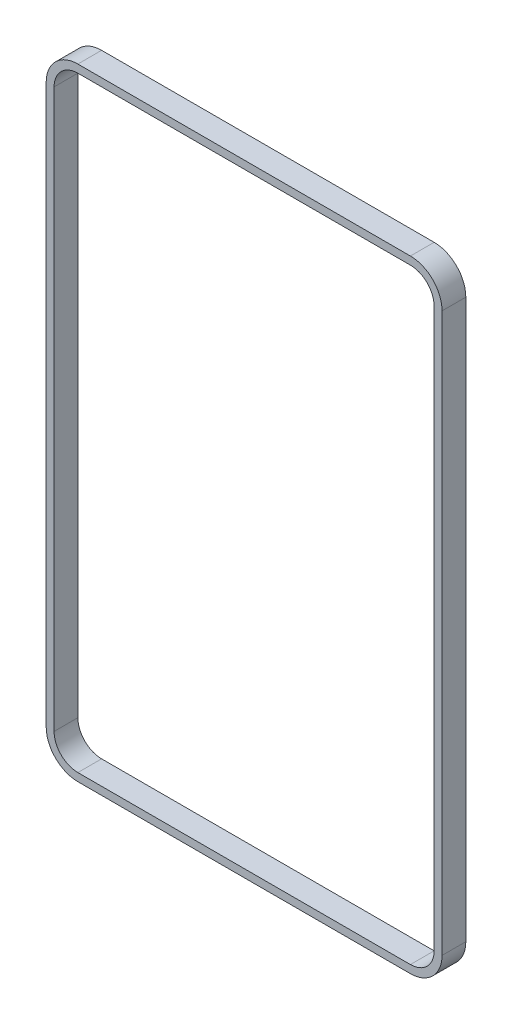
ISO-10303-21;
HEADER;
FILE_DESCRIPTION(('STEP AP214'),'2;1');
FILE_NAME('part.step','',(''),(''),'','','');
FILE_SCHEMA(('AUTOMOTIVE_DESIGN { 1 0 10303 214 1 1 1 1 }'));
ENDSEC;
DATA;
#1=APPLICATION_CONTEXT('core data for automotive mechanical design processes');
#2=APPLICATION_PROTOCOL_DEFINITION('international standard','automotive_design',2000,#1);
#3=PRODUCT_CONTEXT('',#1,'mechanical');
#4=PRODUCT('Part','Part','',(#3));
#5=PRODUCT_RELATED_PRODUCT_CATEGORY('part','',(#4));
#6=PRODUCT_DEFINITION_FORMATION('','',#4);
#7=PRODUCT_DEFINITION_CONTEXT('part definition',#1,'design');
#8=PRODUCT_DEFINITION('design','',#6,#7);
#9=PRODUCT_DEFINITION_SHAPE('','',#8);
#10=(LENGTH_UNIT() NAMED_UNIT(*) SI_UNIT(.MILLI.,.METRE.));
#11=(NAMED_UNIT(*) PLANE_ANGLE_UNIT() SI_UNIT($,.RADIAN.));
#12=(NAMED_UNIT(*) SI_UNIT($,.STERADIAN.) SOLID_ANGLE_UNIT());
#13=UNCERTAINTY_MEASURE_WITH_UNIT(LENGTH_MEASURE(1.E-05),#10,'distance_accuracy_value','');
#14=(GEOMETRIC_REPRESENTATION_CONTEXT(3) GLOBAL_UNCERTAINTY_ASSIGNED_CONTEXT((#13)) GLOBAL_UNIT_ASSIGNED_CONTEXT((#10,
#11,#12)) REPRESENTATION_CONTEXT('',''));
#15=CARTESIAN_POINT('',(0.,0.,0.));
#16=DIRECTION('',(0.,0.,1.));
#17=DIRECTION('',(1.,0.,0.));
#18=AXIS2_PLACEMENT_3D('',#15,#16,#17);
#19=CARTESIAN_POINT('',(13.49375,237.33125,0.));
#20=DIRECTION('',(0.,0.,1.));
#21=DIRECTION('',(1.,0.,0.));
#22=AXIS2_PLACEMENT_3D('',#19,#20,#21);
#23=CYLINDRICAL_SURFACE('',#22,9.52499999999999);
#24=CARTESIAN_POINT('',(13.49375,237.33125,9.525));
#25=DIRECTION('',(0.,0.,1.));
#26=DIRECTION('',(1.,0.,0.));
#27=AXIS2_PLACEMENT_3D('',#24,#25,#26);
#28=CIRCLE('',#27,9.52499999999999);
#29=CARTESIAN_POINT('',(13.49375,246.85625,9.525));
#30=VERTEX_POINT('',#29);
#31=CARTESIAN_POINT('',(3.96875,237.33125,9.525));
#32=VERTEX_POINT('',#31);
#33=EDGE_CURVE('E199',#30,#32,#28,.T.);
#34=ORIENTED_EDGE('',*,*,#33,.T.);
#35=DIRECTION('',(0.,0.,1.));
#36=VECTOR('',#35,1.);
#37=CARTESIAN_POINT('',(3.96875,237.33125,0.));
#38=LINE('',#37,#36);
#39=CARTESIAN_POINT('',(3.96875,237.33125,0.));
#40=VERTEX_POINT('',#39);
#41=EDGE_CURVE('E11',#40,#32,#38,.T.);
#42=ORIENTED_EDGE('',*,*,#41,.F.);
#43=CARTESIAN_POINT('',(13.49375,237.33125,0.));
#44=DIRECTION('',(0.,0.,1.));
#45=DIRECTION('',(1.,0.,0.));
#46=AXIS2_PLACEMENT_3D('',#43,#44,#45);
#47=CIRCLE('',#46,9.52499999999999);
#48=CARTESIAN_POINT('',(13.49375,246.85625,0.));
#49=VERTEX_POINT('',#48);
#50=EDGE_CURVE('E266',#49,#40,#47,.T.);
#51=ORIENTED_EDGE('',*,*,#50,.F.);
#52=DIRECTION('',(0.,0.,1.));
#53=VECTOR('',#52,1.);
#54=CARTESIAN_POINT('',(13.49375,246.85625,0.));
#55=LINE('',#54,#53);
#56=EDGE_CURVE('E227',#49,#30,#55,.T.);
#57=ORIENTED_EDGE('',*,*,#56,.T.);
#58=EDGE_LOOP('',(#34,#42,#51,#57));
#59=FACE_BOUND('',#58,.T.);
#60=ADVANCED_FACE('F36',(#59),#23,.F.);
#61=CARTESIAN_POINT('',(3.96875,0.,0.));
#62=DIRECTION('',(-1.,0.,0.));
#63=DIRECTION('',(0.,0.,1.));
#64=AXIS2_PLACEMENT_3D('',#61,#62,#63);
#65=PLANE('',#64);
#66=DIRECTION('',(0.,-1.,0.));
#67=VECTOR('',#66,1.);
#68=CARTESIAN_POINT('',(3.96875,0.,9.525));
#69=LINE('',#68,#67);
#70=CARTESIAN_POINT('',(3.96875,13.4937500000001,9.525));
#71=VERTEX_POINT('',#70);
#72=EDGE_CURVE('E104',#32,#71,#69,.T.);
#73=ORIENTED_EDGE('',*,*,#72,.T.);
#74=DIRECTION('',(0.,0.,1.));
#75=VECTOR('',#74,1.);
#76=CARTESIAN_POINT('',(3.96875,13.4937500000001,0.));
#77=LINE('',#76,#75);
#78=CARTESIAN_POINT('',(3.96875,13.4937500000001,0.));
#79=VERTEX_POINT('',#78);
#80=EDGE_CURVE('E46',#79,#71,#77,.T.);
#81=ORIENTED_EDGE('',*,*,#80,.F.);
#82=DIRECTION('',(0.,-1.,0.));
#83=VECTOR('',#82,1.);
#84=CARTESIAN_POINT('',(3.96875,0.,0.));
#85=LINE('',#84,#83);
#86=EDGE_CURVE('E54',#40,#79,#85,.T.);
#87=ORIENTED_EDGE('',*,*,#86,.F.);
#88=ORIENTED_EDGE('',*,*,#41,.T.);
#89=EDGE_LOOP('',(#73,#81,#87,#88));
#90=FACE_BOUND('',#89,.T.);
#91=ADVANCED_FACE('F304',(#90),#65,.F.);
#92=CARTESIAN_POINT('',(13.49375,13.49375,0.));
#93=DIRECTION('',(0.,0.,1.));
#94=DIRECTION('',(1.,0.,0.));
#95=AXIS2_PLACEMENT_3D('',#92,#93,#94);
#96=CYLINDRICAL_SURFACE('',#95,9.525);
#97=CARTESIAN_POINT('',(13.49375,13.49375,9.525));
#98=DIRECTION('',(0.,0.,1.));
#99=DIRECTION('',(1.,0.,0.));
#100=AXIS2_PLACEMENT_3D('',#97,#98,#99);
#101=CIRCLE('',#100,9.525);
#102=CARTESIAN_POINT('',(13.4937500000001,3.96875,9.525));
#103=VERTEX_POINT('',#102);
#104=EDGE_CURVE('E167',#71,#103,#101,.T.);
#105=ORIENTED_EDGE('',*,*,#104,.T.);
#106=DIRECTION('',(0.,0.,1.));
#107=VECTOR('',#106,1.);
#108=CARTESIAN_POINT('',(13.4937500000001,3.96875,0.));
#109=LINE('',#108,#107);
#110=CARTESIAN_POINT('',(13.4937500000001,3.96875,0.));
#111=VERTEX_POINT('',#110);
#112=EDGE_CURVE('E165',#111,#103,#109,.T.);
#113=ORIENTED_EDGE('',*,*,#112,.F.);
#114=CARTESIAN_POINT('',(13.49375,13.49375,0.));
#115=DIRECTION('',(0.,0.,1.));
#116=DIRECTION('',(1.,0.,0.));
#117=AXIS2_PLACEMENT_3D('',#114,#115,#116);
#118=CIRCLE('',#117,9.525);
#119=EDGE_CURVE('E156',#79,#111,#118,.T.);
#120=ORIENTED_EDGE('',*,*,#119,.F.);
#121=ORIENTED_EDGE('',*,*,#80,.T.);
#122=EDGE_LOOP('',(#105,#113,#120,#121));
#123=FACE_BOUND('',#122,.T.);
#124=ADVANCED_FACE('F166',(#123),#96,.F.);
#125=CARTESIAN_POINT('',(0.,3.96875,0.));
#126=DIRECTION('',(0.,-1.,0.));
#127=DIRECTION('',(1.,0.,0.));
#128=AXIS2_PLACEMENT_3D('',#125,#126,#127);
#129=PLANE('',#128);
#130=DIRECTION('',(1.,0.,0.));
#131=VECTOR('',#130,1.);
#132=CARTESIAN_POINT('',(0.,3.96875,9.525));
#133=LINE('',#132,#131);
#134=CARTESIAN_POINT('',(146.84375,3.96875,9.525));
#135=VERTEX_POINT('',#134);
#136=EDGE_CURVE('E214',#103,#135,#133,.T.);
#137=ORIENTED_EDGE('',*,*,#136,.T.);
#138=DIRECTION('',(0.,0.,1.));
#139=VECTOR('',#138,1.);
#140=CARTESIAN_POINT('',(146.84375,3.96875,0.));
#141=LINE('',#140,#139);
#142=CARTESIAN_POINT('',(146.84375,3.96875,0.));
#143=VERTEX_POINT('',#142);
#144=EDGE_CURVE('E170',#143,#135,#141,.T.);
#145=ORIENTED_EDGE('',*,*,#144,.F.);
#146=DIRECTION('',(1.,0.,0.));
#147=VECTOR('',#146,1.);
#148=CARTESIAN_POINT('',(0.,3.96875,0.));
#149=LINE('',#148,#147);
#150=EDGE_CURVE('E160',#111,#143,#149,.T.);
#151=ORIENTED_EDGE('',*,*,#150,.F.);
#152=ORIENTED_EDGE('',*,*,#112,.T.);
#153=EDGE_LOOP('',(#137,#145,#151,#152));
#154=FACE_BOUND('',#153,.T.);
#155=ADVANCED_FACE('F172',(#154),#129,.F.);
#156=CARTESIAN_POINT('',(146.84375,13.49375,0.));
#157=DIRECTION('',(0.,0.,1.));
#158=DIRECTION('',(1.,0.,0.));
#159=AXIS2_PLACEMENT_3D('',#156,#157,#158);
#160=CYLINDRICAL_SURFACE('',#159,9.52499999999999);
#161=CARTESIAN_POINT('',(146.84375,13.49375,9.525));
#162=DIRECTION('',(0.,0.,1.));
#163=DIRECTION('',(1.,0.,0.));
#164=AXIS2_PLACEMENT_3D('',#161,#162,#163);
#165=CIRCLE('',#164,9.52499999999999);
#166=CARTESIAN_POINT('',(156.36875,13.49375,9.525));
#167=VERTEX_POINT('',#166);
#168=EDGE_CURVE('E211',#135,#167,#165,.T.);
#169=ORIENTED_EDGE('',*,*,#168,.T.);
#170=DIRECTION('',(0.,0.,1.));
#171=VECTOR('',#170,1.);
#172=CARTESIAN_POINT('',(156.36875,13.49375,0.));
#173=LINE('',#172,#171);
#174=CARTESIAN_POINT('',(156.36875,13.49375,0.));
#175=VERTEX_POINT('',#174);
#176=EDGE_CURVE('E221',#175,#167,#173,.T.);
#177=ORIENTED_EDGE('',*,*,#176,.F.);
#178=CARTESIAN_POINT('',(146.84375,13.49375,0.));
#179=DIRECTION('',(0.,0.,1.));
#180=DIRECTION('',(1.,0.,0.));
#181=AXIS2_PLACEMENT_3D('',#178,#179,#180);
#182=CIRCLE('',#181,9.52499999999999);
#183=EDGE_CURVE('E175',#143,#175,#182,.T.);
#184=ORIENTED_EDGE('',*,*,#183,.F.);
#185=ORIENTED_EDGE('',*,*,#144,.T.);
#186=EDGE_LOOP('',(#169,#177,#184,#185));
#187=FACE_BOUND('',#186,.T.);
#188=ADVANCED_FACE('F318',(#187),#160,.F.);
#189=CARTESIAN_POINT('',(156.36875,0.,0.));
#190=DIRECTION('',(-1.,0.,0.));
#191=DIRECTION('',(0.,0.,1.));
#192=AXIS2_PLACEMENT_3D('',#189,#190,#191);
#193=PLANE('',#192);
#194=DIRECTION('',(0.,-1.,0.));
#195=VECTOR('',#194,1.);
#196=CARTESIAN_POINT('',(156.36875,0.,9.525));
#197=LINE('',#196,#195);
#198=CARTESIAN_POINT('',(156.36875,237.33125,9.525));
#199=VERTEX_POINT('',#198);
#200=EDGE_CURVE('E208',#199,#167,#197,.T.);
#201=ORIENTED_EDGE('',*,*,#200,.F.);
#202=DIRECTION('',(0.,0.,1.));
#203=VECTOR('',#202,1.);
#204=CARTESIAN_POINT('',(156.36875,237.33125,0.));
#205=LINE('',#204,#203);
#206=CARTESIAN_POINT('',(156.36875,237.33125,0.));
#207=VERTEX_POINT('',#206);
#208=EDGE_CURVE('E223',#207,#199,#205,.T.);
#209=ORIENTED_EDGE('',*,*,#208,.F.);
#210=DIRECTION('',(0.,-1.,0.));
#211=VECTOR('',#210,1.);
#212=CARTESIAN_POINT('',(156.36875,0.,0.));
#213=LINE('',#212,#211);
#214=EDGE_CURVE('E177',#207,#175,#213,.T.);
#215=ORIENTED_EDGE('',*,*,#214,.T.);
#216=ORIENTED_EDGE('',*,*,#176,.T.);
#217=EDGE_LOOP('',(#201,#209,#215,#216));
#218=FACE_BOUND('',#217,.T.);
#219=ADVANCED_FACE('F291',(#218),#193,.T.);
#220=CARTESIAN_POINT('',(146.84375,237.33125,0.));
#221=DIRECTION('',(0.,0.,1.));
#222=DIRECTION('',(1.,0.,0.));
#223=AXIS2_PLACEMENT_3D('',#220,#221,#222);
#224=CYLINDRICAL_SURFACE('',#223,9.52499999999998);
#225=CARTESIAN_POINT('',(146.84375,237.33125,9.525));
#226=DIRECTION('',(0.,0.,1.));
#227=DIRECTION('',(1.,0.,0.));
#228=AXIS2_PLACEMENT_3D('',#225,#226,#227);
#229=CIRCLE('',#228,9.52499999999998);
#230=CARTESIAN_POINT('',(146.84375,246.85625,9.525));
#231=VERTEX_POINT('',#230);
#232=EDGE_CURVE('E205',#231,#199,#229,.F.);
#233=ORIENTED_EDGE('',*,*,#232,.F.);
#234=DIRECTION('',(0.,0.,1.));
#235=VECTOR('',#234,1.);
#236=CARTESIAN_POINT('',(146.84375,246.85625,0.));
#237=LINE('',#236,#235);
#238=CARTESIAN_POINT('',(146.84375,246.85625,0.));
#239=VERTEX_POINT('',#238);
#240=EDGE_CURVE('E225',#239,#231,#237,.T.);
#241=ORIENTED_EDGE('',*,*,#240,.F.);
#242=CARTESIAN_POINT('',(146.84375,237.33125,0.));
#243=DIRECTION('',(0.,0.,1.));
#244=DIRECTION('',(1.,0.,0.));
#245=AXIS2_PLACEMENT_3D('',#242,#243,#244);
#246=CIRCLE('',#245,9.52499999999998);
#247=EDGE_CURVE('E285',#239,#207,#246,.F.);
#248=ORIENTED_EDGE('',*,*,#247,.T.);
#249=ORIENTED_EDGE('',*,*,#208,.T.);
#250=EDGE_LOOP('',(#233,#241,#248,#249));
#251=FACE_BOUND('',#250,.T.);
#252=ADVANCED_FACE('F297',(#251),#224,.F.);
#253=CARTESIAN_POINT('',(0.,0.79375,0.));
#254=DIRECTION('',(0.,1.,0.));
#255=DIRECTION('',(-1.,0.,0.));
#256=AXIS2_PLACEMENT_3D('',#253,#254,#255);
#257=PLANE('',#256);
#258=DIRECTION('',(-1.,0.,0.));
#259=VECTOR('',#258,1.);
#260=CARTESIAN_POINT('',(0.,0.79375,9.525));
#261=LINE('',#260,#259);
#262=CARTESIAN_POINT('',(146.84375,0.793749999999999,9.525));
#263=VERTEX_POINT('',#262);
#264=CARTESIAN_POINT('',(13.49375,0.793749999999998,9.525));
#265=VERTEX_POINT('',#264);
#266=EDGE_CURVE('E182',#263,#265,#261,.T.);
#267=ORIENTED_EDGE('',*,*,#266,.T.);
#268=DIRECTION('',(0.,0.,1.));
#269=VECTOR('',#268,1.);
#270=CARTESIAN_POINT('',(13.49375,0.793749999999998,0.));
#271=LINE('',#270,#269);
#272=CARTESIAN_POINT('',(13.49375,0.793749999999998,0.));
#273=VERTEX_POINT('',#272);
#274=EDGE_CURVE('E229',#273,#265,#271,.T.);
#275=ORIENTED_EDGE('',*,*,#274,.F.);
#276=DIRECTION('',(-1.,0.,0.));
#277=VECTOR('',#276,1.);
#278=CARTESIAN_POINT('',(0.,0.79375,0.));
#279=LINE('',#278,#277);
#280=CARTESIAN_POINT('',(146.84375,0.793749999999999,0.));
#281=VERTEX_POINT('',#280);
#282=EDGE_CURVE('E217',#281,#273,#279,.T.);
#283=ORIENTED_EDGE('',*,*,#282,.F.);
#284=DIRECTION('',(0.,0.,1.));
#285=VECTOR('',#284,1.);
#286=CARTESIAN_POINT('',(146.84375,0.793749999999999,0.));
#287=LINE('',#286,#285);
#288=EDGE_CURVE('E40',#281,#263,#287,.T.);
#289=ORIENTED_EDGE('',*,*,#288,.T.);
#290=EDGE_LOOP('',(#267,#275,#283,#289));
#291=FACE_BOUND('',#290,.T.);
#292=ADVANCED_FACE('F38',(#291),#257,.F.);
#293=CARTESIAN_POINT('',(13.49375,13.49375,0.));
#294=DIRECTION('',(0.,0.,1.));
#295=DIRECTION('',(1.,0.,0.));
#296=AXIS2_PLACEMENT_3D('',#293,#294,#295);
#297=CYLINDRICAL_SURFACE('',#296,12.7);
#298=CARTESIAN_POINT('',(13.49375,13.49375,9.525));
#299=DIRECTION('',(0.,0.,1.));
#300=DIRECTION('',(1.,0.,0.));
#301=AXIS2_PLACEMENT_3D('',#298,#299,#300);
#302=CIRCLE('',#301,12.7);
#303=CARTESIAN_POINT('',(0.793749999999998,13.49375,9.525));
#304=VERTEX_POINT('',#303);
#305=EDGE_CURVE('E197',#265,#304,#302,.F.);
#306=ORIENTED_EDGE('',*,*,#305,.T.);
#307=DIRECTION('',(0.,0.,1.));
#308=VECTOR('',#307,1.);
#309=CARTESIAN_POINT('',(0.793749999999998,13.49375,0.));
#310=LINE('',#309,#308);
#311=CARTESIAN_POINT('',(0.793749999999998,13.49375,0.));
#312=VERTEX_POINT('',#311);
#313=EDGE_CURVE('E232',#312,#304,#310,.T.);
#314=ORIENTED_EDGE('',*,*,#313,.F.);
#315=CARTESIAN_POINT('',(13.49375,13.49375,0.));
#316=DIRECTION('',(0.,0.,1.));
#317=DIRECTION('',(1.,0.,0.));
#318=AXIS2_PLACEMENT_3D('',#315,#316,#317);
#319=CIRCLE('',#318,12.7);
#320=EDGE_CURVE('E264',#273,#312,#319,.F.);
#321=ORIENTED_EDGE('',*,*,#320,.F.);
#322=ORIENTED_EDGE('',*,*,#274,.T.);
#323=EDGE_LOOP('',(#306,#314,#321,#322));
#324=FACE_BOUND('',#323,.T.);
#325=ADVANCED_FACE('F263',(#324),#297,.T.);
#326=CARTESIAN_POINT('',(0.79375,0.,0.));
#327=DIRECTION('',(1.,0.,0.));
#328=DIRECTION('',(0.,1.,0.));
#329=AXIS2_PLACEMENT_3D('',#326,#327,#328);
#330=PLANE('',#329);
#331=DIRECTION('',(0.,1.,0.));
#332=VECTOR('',#331,1.);
#333=CARTESIAN_POINT('',(0.79375,0.,9.525));
#334=LINE('',#333,#332);
#335=CARTESIAN_POINT('',(0.793749999999998,237.33125,9.525));
#336=VERTEX_POINT('',#335);
#337=EDGE_CURVE('E195',#304,#336,#334,.T.);
#338=ORIENTED_EDGE('',*,*,#337,.T.);
#339=DIRECTION('',(0.,0.,1.));
#340=VECTOR('',#339,1.);
#341=CARTESIAN_POINT('',(0.793749999999998,237.33125,0.));
#342=LINE('',#341,#340);
#343=CARTESIAN_POINT('',(0.793749999999998,237.33125,0.));
#344=VERTEX_POINT('',#343);
#345=EDGE_CURVE('E235',#344,#336,#342,.T.);
#346=ORIENTED_EDGE('',*,*,#345,.F.);
#347=DIRECTION('',(0.,1.,0.));
#348=VECTOR('',#347,1.);
#349=CARTESIAN_POINT('',(0.79375,0.,0.));
#350=LINE('',#349,#348);
#351=EDGE_CURVE('E267',#312,#344,#350,.T.);
#352=ORIENTED_EDGE('',*,*,#351,.F.);
#353=ORIENTED_EDGE('',*,*,#313,.T.);
#354=EDGE_LOOP('',(#338,#346,#352,#353));
#355=FACE_BOUND('',#354,.T.);
#356=ADVANCED_FACE('F331',(#355),#330,.F.);
#357=CARTESIAN_POINT('',(13.49375,237.33125,0.));
#358=DIRECTION('',(0.,0.,1.));
#359=DIRECTION('',(1.,0.,0.));
#360=AXIS2_PLACEMENT_3D('',#357,#358,#359);
#361=CYLINDRICAL_SURFACE('',#360,12.7);
#362=CARTESIAN_POINT('',(13.49375,237.33125,9.525));
#363=DIRECTION('',(0.,0.,1.));
#364=DIRECTION('',(1.,0.,0.));
#365=AXIS2_PLACEMENT_3D('',#362,#363,#364);
#366=CIRCLE('',#365,12.7);
#367=CARTESIAN_POINT('',(13.49375,250.03125,9.525));
#368=VERTEX_POINT('',#367);
#369=EDGE_CURVE('E193',#336,#368,#366,.F.);
#370=ORIENTED_EDGE('',*,*,#369,.T.);
#371=DIRECTION('',(0.,0.,1.));
#372=VECTOR('',#371,1.);
#373=CARTESIAN_POINT('',(13.49375,250.03125,0.));
#374=LINE('',#373,#372);
#375=CARTESIAN_POINT('',(13.49375,250.03125,0.));
#376=VERTEX_POINT('',#375);
#377=EDGE_CURVE('E238',#376,#368,#374,.T.);
#378=ORIENTED_EDGE('',*,*,#377,.F.);
#379=CARTESIAN_POINT('',(13.49375,237.33125,0.));
#380=DIRECTION('',(0.,0.,1.));
#381=DIRECTION('',(1.,0.,0.));
#382=AXIS2_PLACEMENT_3D('',#379,#380,#381);
#383=CIRCLE('',#382,12.7);
#384=EDGE_CURVE('E278',#344,#376,#383,.F.);
#385=ORIENTED_EDGE('',*,*,#384,.F.);
#386=ORIENTED_EDGE('',*,*,#345,.T.);
#387=EDGE_LOOP('',(#370,#378,#385,#386));
#388=FACE_BOUND('',#387,.T.);
#389=ADVANCED_FACE('F334',(#388),#361,.T.);
#390=CARTESIAN_POINT('',(0.,250.03125,0.));
#391=DIRECTION('',(0.,-1.,0.));
#392=DIRECTION('',(0.,0.,-1.));
#393=AXIS2_PLACEMENT_3D('',#390,#391,#392);
#394=PLANE('',#393);
#395=DIRECTION('',(1.,0.,0.));
#396=VECTOR('',#395,1.);
#397=CARTESIAN_POINT('',(0.,250.03125,9.525));
#398=LINE('',#397,#396);
#399=CARTESIAN_POINT('',(146.84375,250.03125,9.525));
#400=VERTEX_POINT('',#399);
#401=EDGE_CURVE('E191',#368,#400,#398,.T.);
#402=ORIENTED_EDGE('',*,*,#401,.T.);
#403=DIRECTION('',(0.,0.,1.));
#404=VECTOR('',#403,1.);
#405=CARTESIAN_POINT('',(146.84375,250.03125,0.));
#406=LINE('',#405,#404);
#407=CARTESIAN_POINT('',(146.84375,250.03125,0.));
#408=VERTEX_POINT('',#407);
#409=EDGE_CURVE('E241',#408,#400,#406,.T.);
#410=ORIENTED_EDGE('',*,*,#409,.F.);
#411=DIRECTION('',(1.,0.,0.));
#412=VECTOR('',#411,1.);
#413=CARTESIAN_POINT('',(0.,250.03125,0.));
#414=LINE('',#413,#412);
#415=EDGE_CURVE('E276',#376,#408,#414,.T.);
#416=ORIENTED_EDGE('',*,*,#415,.F.);
#417=ORIENTED_EDGE('',*,*,#377,.T.);
#418=EDGE_LOOP('',(#402,#410,#416,#417));
#419=FACE_BOUND('',#418,.T.);
#420=ADVANCED_FACE('F338',(#419),#394,.F.);
#421=CARTESIAN_POINT('',(146.84375,237.33125,0.));
#422=DIRECTION('',(0.,0.,1.));
#423=DIRECTION('',(1.,0.,0.));
#424=AXIS2_PLACEMENT_3D('',#421,#422,#423);
#425=CYLINDRICAL_SURFACE('',#424,12.7);
#426=CARTESIAN_POINT('',(146.84375,237.33125,9.525));
#427=DIRECTION('',(0.,0.,1.));
#428=DIRECTION('',(1.,0.,0.));
#429=AXIS2_PLACEMENT_3D('',#426,#427,#428);
#430=CIRCLE('',#429,12.7);
#431=CARTESIAN_POINT('',(159.54375,237.33125,9.525));
#432=VERTEX_POINT('',#431);
#433=EDGE_CURVE('E189',#400,#432,#430,.F.);
#434=ORIENTED_EDGE('',*,*,#433,.T.);
#435=DIRECTION('',(0.,0.,1.));
#436=VECTOR('',#435,1.);
#437=CARTESIAN_POINT('',(159.54375,237.33125,0.));
#438=LINE('',#437,#436);
#439=CARTESIAN_POINT('',(159.54375,237.33125,0.));
#440=VERTEX_POINT('',#439);
#441=EDGE_CURVE('E244',#440,#432,#438,.T.);
#442=ORIENTED_EDGE('',*,*,#441,.F.);
#443=CARTESIAN_POINT('',(146.84375,237.33125,0.));
#444=DIRECTION('',(0.,0.,1.));
#445=DIRECTION('',(1.,0.,0.));
#446=AXIS2_PLACEMENT_3D('',#443,#444,#445);
#447=CIRCLE('',#446,12.7);
#448=EDGE_CURVE('E274',#408,#440,#447,.F.);
#449=ORIENTED_EDGE('',*,*,#448,.F.);
#450=ORIENTED_EDGE('',*,*,#409,.T.);
#451=EDGE_LOOP('',(#434,#442,#449,#450));
#452=FACE_BOUND('',#451,.T.);
#453=ADVANCED_FACE('F342',(#452),#425,.T.);
#454=CARTESIAN_POINT('',(159.54375,0.,0.));
#455=DIRECTION('',(-1.,0.,0.));
#456=DIRECTION('',(0.,0.,1.));
#457=AXIS2_PLACEMENT_3D('',#454,#455,#456);
#458=PLANE('',#457);
#459=DIRECTION('',(0.,-1.,0.));
#460=VECTOR('',#459,1.);
#461=CARTESIAN_POINT('',(159.54375,0.,9.525));
#462=LINE('',#461,#460);
#463=CARTESIAN_POINT('',(159.54375,13.49375,9.525));
#464=VERTEX_POINT('',#463);
#465=EDGE_CURVE('E187',#432,#464,#462,.T.);
#466=ORIENTED_EDGE('',*,*,#465,.T.);
#467=DIRECTION('',(0.,0.,1.));
#468=VECTOR('',#467,1.);
#469=CARTESIAN_POINT('',(159.54375,13.49375,0.));
#470=LINE('',#469,#468);
#471=CARTESIAN_POINT('',(159.54375,13.49375,0.));
#472=VERTEX_POINT('',#471);
#473=EDGE_CURVE('E246',#472,#464,#470,.T.);
#474=ORIENTED_EDGE('',*,*,#473,.F.);
#475=DIRECTION('',(0.,-1.,0.));
#476=VECTOR('',#475,1.);
#477=CARTESIAN_POINT('',(159.54375,0.,0.));
#478=LINE('',#477,#476);
#479=EDGE_CURVE('E270',#440,#472,#478,.T.);
#480=ORIENTED_EDGE('',*,*,#479,.F.);
#481=ORIENTED_EDGE('',*,*,#441,.T.);
#482=EDGE_LOOP('',(#466,#474,#480,#481));
#483=FACE_BOUND('',#482,.T.);
#484=ADVANCED_FACE('F346',(#483),#458,.F.);
#485=CARTESIAN_POINT('',(146.84375,13.49375,0.));
#486=DIRECTION('',(0.,0.,1.));
#487=DIRECTION('',(1.,0.,0.));
#488=AXIS2_PLACEMENT_3D('',#485,#486,#487);
#489=CYLINDRICAL_SURFACE('',#488,12.7);
#490=CARTESIAN_POINT('',(146.84375,13.49375,9.525));
#491=DIRECTION('',(0.,0.,1.));
#492=DIRECTION('',(1.,0.,0.));
#493=AXIS2_PLACEMENT_3D('',#490,#491,#492);
#494=CIRCLE('',#493,12.7);
#495=EDGE_CURVE('E185',#464,#263,#494,.F.);
#496=ORIENTED_EDGE('',*,*,#495,.T.);
#497=ORIENTED_EDGE('',*,*,#288,.F.);
#498=CARTESIAN_POINT('',(146.84375,13.49375,0.));
#499=DIRECTION('',(0.,0.,1.));
#500=DIRECTION('',(1.,0.,0.));
#501=AXIS2_PLACEMENT_3D('',#498,#499,#500);
#502=CIRCLE('',#501,12.7);
#503=EDGE_CURVE('E117',#472,#281,#502,.F.);
#504=ORIENTED_EDGE('',*,*,#503,.F.);
#505=ORIENTED_EDGE('',*,*,#473,.T.);
#506=EDGE_LOOP('',(#496,#497,#504,#505));
#507=FACE_BOUND('',#506,.T.);
#508=ADVANCED_FACE('F327',(#507),#489,.T.);
#509=CARTESIAN_POINT('',(0.,246.85625,0.));
#510=DIRECTION('',(0.,-1.,0.));
#511=DIRECTION('',(0.,0.,-1.));
#512=AXIS2_PLACEMENT_3D('',#509,#510,#511);
#513=PLANE('',#512);
#514=DIRECTION('',(1.,0.,0.));
#515=VECTOR('',#514,1.);
#516=CARTESIAN_POINT('',(0.,246.85625,9.525));
#517=LINE('',#516,#515);
#518=EDGE_CURVE('E202',#30,#231,#517,.T.);
#519=ORIENTED_EDGE('',*,*,#518,.F.);
#520=ORIENTED_EDGE('',*,*,#56,.F.);
#521=DIRECTION('',(1.,0.,0.));
#522=VECTOR('',#521,1.);
#523=CARTESIAN_POINT('',(0.,246.85625,0.));
#524=LINE('',#523,#522);
#525=EDGE_CURVE('E282',#49,#239,#524,.T.);
#526=ORIENTED_EDGE('',*,*,#525,.T.);
#527=ORIENTED_EDGE('',*,*,#240,.T.);
#528=EDGE_LOOP('',(#519,#520,#526,#527));
#529=FACE_BOUND('',#528,.T.);
#530=ADVANCED_FACE('F300',(#529),#513,.T.);
#531=CARTESIAN_POINT('',(0.,0.,0.));
#532=DIRECTION('',(0.,0.,1.));
#533=DIRECTION('',(1.,0.,0.));
#534=AXIS2_PLACEMENT_3D('',#531,#532,#533);
#535=PLANE('',#534);
#536=ORIENTED_EDGE('',*,*,#282,.T.);
#537=ORIENTED_EDGE('',*,*,#320,.T.);
#538=ORIENTED_EDGE('',*,*,#351,.T.);
#539=ORIENTED_EDGE('',*,*,#384,.T.);
#540=ORIENTED_EDGE('',*,*,#415,.T.);
#541=ORIENTED_EDGE('',*,*,#448,.T.);
#542=ORIENTED_EDGE('',*,*,#479,.T.);
#543=ORIENTED_EDGE('',*,*,#503,.T.);
#544=EDGE_LOOP('',(#536,#537,#538,#539,#540,#541,#542,#543));
#545=FACE_BOUND('',#544,.T.);
#546=ORIENTED_EDGE('',*,*,#50,.T.);
#547=ORIENTED_EDGE('',*,*,#86,.T.);
#548=ORIENTED_EDGE('',*,*,#119,.T.);
#549=ORIENTED_EDGE('',*,*,#150,.T.);
#550=ORIENTED_EDGE('',*,*,#183,.T.);
#551=ORIENTED_EDGE('',*,*,#214,.F.);
#552=ORIENTED_EDGE('',*,*,#247,.F.);
#553=ORIENTED_EDGE('',*,*,#525,.F.);
#554=EDGE_LOOP('',(#546,#547,#548,#549,#550,#551,#552,#553));
#555=FACE_BOUND('',#554,.T.);
#556=ADVANCED_FACE('F158',(#545,#555),#535,.F.);
#557=CARTESIAN_POINT('',(0.,0.,9.525));
#558=DIRECTION('',(0.,0.,1.));
#559=DIRECTION('',(1.,0.,0.));
#560=AXIS2_PLACEMENT_3D('',#557,#558,#559);
#561=PLANE('',#560);
#562=ORIENTED_EDGE('',*,*,#266,.F.);
#563=ORIENTED_EDGE('',*,*,#495,.F.);
#564=ORIENTED_EDGE('',*,*,#465,.F.);
#565=ORIENTED_EDGE('',*,*,#433,.F.);
#566=ORIENTED_EDGE('',*,*,#401,.F.);
#567=ORIENTED_EDGE('',*,*,#369,.F.);
#568=ORIENTED_EDGE('',*,*,#337,.F.);
#569=ORIENTED_EDGE('',*,*,#305,.F.);
#570=EDGE_LOOP('',(#562,#563,#564,#565,#566,#567,#568,#569));
#571=FACE_BOUND('',#570,.T.);
#572=ORIENTED_EDGE('',*,*,#33,.F.);
#573=ORIENTED_EDGE('',*,*,#518,.T.);
#574=ORIENTED_EDGE('',*,*,#232,.T.);
#575=ORIENTED_EDGE('',*,*,#200,.T.);
#576=ORIENTED_EDGE('',*,*,#168,.F.);
#577=ORIENTED_EDGE('',*,*,#136,.F.);
#578=ORIENTED_EDGE('',*,*,#104,.F.);
#579=ORIENTED_EDGE('',*,*,#72,.F.);
#580=EDGE_LOOP('',(#572,#573,#574,#575,#576,#577,#578,#579));
#581=FACE_BOUND('',#580,.T.);
#582=ADVANCED_FACE('F257',(#571,#581),#561,.T.);
#583=CLOSED_SHELL('',(#60,#91,#124,#155,#188,#219,#252,#292,#325,#356,#389,#420,#453,#484,#508,
#530,#556,#582));
#584=MANIFOLD_SOLID_BREP('B2',#583);
#585=ADVANCED_BREP_SHAPE_REPRESENTATION('',(#18,#584),#14);
#586=SHAPE_DEFINITION_REPRESENTATION(#9,#585);
ENDSEC;
END-ISO-10303-21;
